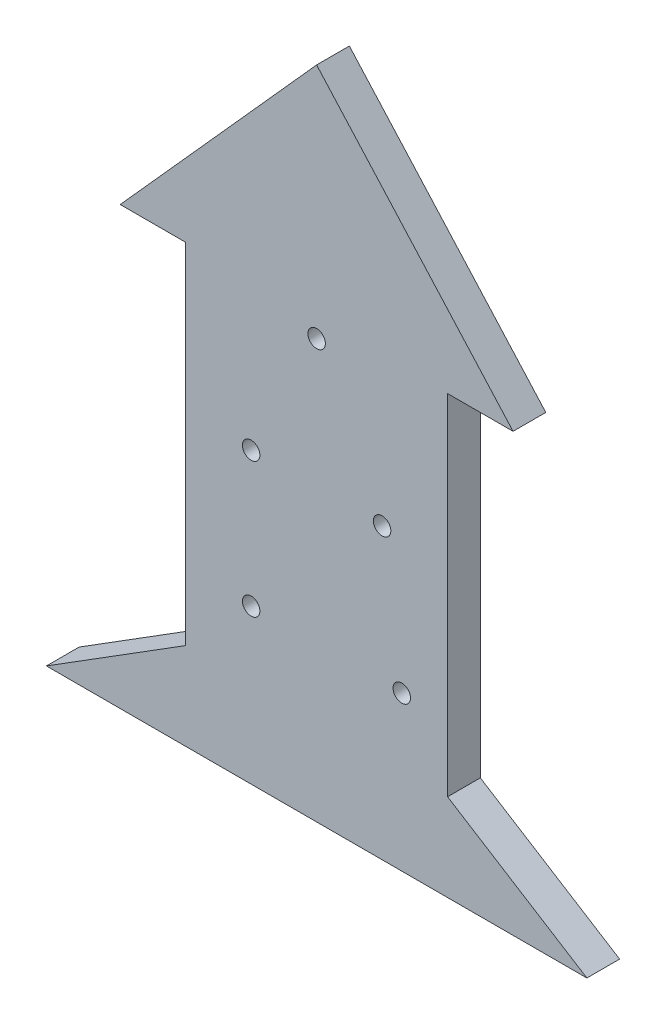
ISO-10303-21;
HEADER;
FILE_DESCRIPTION(('STEP AP214'),'2;1');
FILE_NAME('part.step','',(''),(''),'','','');
FILE_SCHEMA(('AUTOMOTIVE_DESIGN { 1 0 10303 214 1 1 1 1 }'));
ENDSEC;
DATA;
#1=APPLICATION_CONTEXT('core data for automotive mechanical design processes');
#2=APPLICATION_PROTOCOL_DEFINITION('international standard','automotive_design',2000,#1);
#3=PRODUCT_CONTEXT('',#1,'mechanical');
#4=PRODUCT('Part','Part','',(#3));
#5=PRODUCT_RELATED_PRODUCT_CATEGORY('part','',(#4));
#6=PRODUCT_DEFINITION_FORMATION('','',#4);
#7=PRODUCT_DEFINITION_CONTEXT('part definition',#1,'design');
#8=PRODUCT_DEFINITION('design','',#6,#7);
#9=PRODUCT_DEFINITION_SHAPE('','',#8);
#10=(LENGTH_UNIT() NAMED_UNIT(*) SI_UNIT(.MILLI.,.METRE.));
#11=(NAMED_UNIT(*) PLANE_ANGLE_UNIT() SI_UNIT($,.RADIAN.));
#12=(NAMED_UNIT(*) SI_UNIT($,.STERADIAN.) SOLID_ANGLE_UNIT());
#13=UNCERTAINTY_MEASURE_WITH_UNIT(LENGTH_MEASURE(1.E-05),#10,'distance_accuracy_value','');
#14=(GEOMETRIC_REPRESENTATION_CONTEXT(3) GLOBAL_UNCERTAINTY_ASSIGNED_CONTEXT((#13)) GLOBAL_UNIT_ASSIGNED_CONTEXT((#10,
#11,#12)) REPRESENTATION_CONTEXT('',''));
#15=CARTESIAN_POINT('',(0.,0.,0.));
#16=DIRECTION('',(0.,0.,1.));
#17=DIRECTION('',(1.,0.,0.));
#18=AXIS2_PLACEMENT_3D('',#15,#16,#17);
#19=CARTESIAN_POINT('',(-90.,79.2857142857143,15.));
#20=DIRECTION('',(0.,1.,0.));
#21=DIRECTION('',(-1.,0.,0.));
#22=AXIS2_PLACEMENT_3D('',#19,#20,#21);
#23=PLANE('',#22);
#24=DIRECTION('',(1.,0.,0.));
#25=VECTOR('',#24,1.);
#26=CARTESIAN_POINT('',(-90.,79.2857142857143,0.));
#27=LINE('',#26,#25);
#28=CARTESIAN_POINT('',(-90.,79.2857142857143,0.));
#29=VERTEX_POINT('',#28);
#30=CARTESIAN_POINT('',(-60.,79.2857142857144,0.));
#31=VERTEX_POINT('',#30);
#32=EDGE_CURVE('E147',#29,#31,#27,.T.);
#33=ORIENTED_EDGE('',*,*,#32,.T.);
#34=DIRECTION('',(0.,0.,-1.));
#35=VECTOR('',#34,1.);
#36=CARTESIAN_POINT('',(-60.,79.2857142857144,15.));
#37=LINE('',#36,#35);
#38=CARTESIAN_POINT('',(-60.,79.2857142857144,15.));
#39=VERTEX_POINT('',#38);
#40=EDGE_CURVE('E11',#39,#31,#37,.T.);
#41=ORIENTED_EDGE('',*,*,#40,.F.);
#42=DIRECTION('',(1.,0.,0.));
#43=VECTOR('',#42,1.);
#44=CARTESIAN_POINT('',(-90.,79.2857142857143,15.));
#45=LINE('',#44,#43);
#46=CARTESIAN_POINT('',(-90.,79.2857142857143,15.));
#47=VERTEX_POINT('',#46);
#48=EDGE_CURVE('E178',#47,#39,#45,.T.);
#49=ORIENTED_EDGE('',*,*,#48,.F.);
#50=DIRECTION('',(0.,0.,-1.));
#51=VECTOR('',#50,1.);
#52=CARTESIAN_POINT('',(-90.,79.2857142857143,15.));
#53=LINE('',#52,#51);
#54=EDGE_CURVE('E143',#47,#29,#53,.T.);
#55=ORIENTED_EDGE('',*,*,#54,.T.);
#56=EDGE_LOOP('',(#33,#41,#49,#55));
#57=FACE_BOUND('',#56,.T.);
#58=ADVANCED_FACE('F39',(#57),#23,.F.);
#59=CARTESIAN_POINT('',(-60.,79.2857142857144,15.));
#60=DIRECTION('',(1.,0.,0.));
#61=DIRECTION('',(0.,1.,0.));
#62=AXIS2_PLACEMENT_3D('',#59,#60,#61);
#63=PLANE('',#62);
#64=DIRECTION('',(0.,-1.,0.));
#65=VECTOR('',#64,1.);
#66=CARTESIAN_POINT('',(-60.,79.2857142857144,0.));
#67=LINE('',#66,#65);
#68=CARTESIAN_POINT('',(-60.,-80.7142857142856,0.));
#69=VERTEX_POINT('',#68);
#70=EDGE_CURVE('E151',#31,#69,#67,.T.);
#71=ORIENTED_EDGE('',*,*,#70,.T.);
#72=DIRECTION('',(0.,0.,-1.));
#73=VECTOR('',#72,1.);
#74=CARTESIAN_POINT('',(-60.,-80.7142857142856,15.));
#75=LINE('',#74,#73);
#76=CARTESIAN_POINT('',(-60.,-80.7142857142856,15.));
#77=VERTEX_POINT('',#76);
#78=EDGE_CURVE('E49',#77,#69,#75,.T.);
#79=ORIENTED_EDGE('',*,*,#78,.F.);
#80=DIRECTION('',(0.,-1.,0.));
#81=VECTOR('',#80,1.);
#82=CARTESIAN_POINT('',(-60.,79.2857142857144,15.));
#83=LINE('',#82,#81);
#84=EDGE_CURVE('E100',#39,#77,#83,.T.);
#85=ORIENTED_EDGE('',*,*,#84,.F.);
#86=ORIENTED_EDGE('',*,*,#40,.T.);
#87=EDGE_LOOP('',(#71,#79,#85,#86));
#88=FACE_BOUND('',#87,.T.);
#89=ADVANCED_FACE('F266',(#88),#63,.F.);
#90=CARTESIAN_POINT('',(-60.,-80.7142857142856,15.));
#91=DIRECTION('',(0.531072594271218,-0.847326324159729,0.));
#92=DIRECTION('',(0.847326324159729,0.531072594271218,0.));
#93=AXIS2_PLACEMENT_3D('',#90,#91,#92);
#94=PLANE('',#93);
#95=DIRECTION('',(-0.847326324159729,-0.531072594271218,0.));
#96=VECTOR('',#95,1.);
#97=CARTESIAN_POINT('',(-60.,-80.7142857142856,0.));
#98=LINE('',#97,#96);
#99=CARTESIAN_POINT('',(-123.82,-120.714285714286,0.));
#100=VERTEX_POINT('',#99);
#101=EDGE_CURVE('E155',#69,#100,#98,.T.);
#102=ORIENTED_EDGE('',*,*,#101,.T.);
#103=DIRECTION('',(0.,0.,-1.));
#104=VECTOR('',#103,1.);
#105=CARTESIAN_POINT('',(-123.82,-120.714285714286,15.));
#106=LINE('',#105,#104);
#107=CARTESIAN_POINT('',(-123.82,-120.714285714286,15.));
#108=VERTEX_POINT('',#107);
#109=EDGE_CURVE('E191',#108,#100,#106,.T.);
#110=ORIENTED_EDGE('',*,*,#109,.F.);
#111=DIRECTION('',(-0.847326324159729,-0.531072594271218,0.));
#112=VECTOR('',#111,1.);
#113=CARTESIAN_POINT('',(-60.,-80.7142857142856,15.));
#114=LINE('',#113,#112);
#115=EDGE_CURVE('E230',#77,#108,#114,.T.);
#116=ORIENTED_EDGE('',*,*,#115,.F.);
#117=ORIENTED_EDGE('',*,*,#78,.T.);
#118=EDGE_LOOP('',(#102,#110,#116,#117));
#119=FACE_BOUND('',#118,.T.);
#120=ADVANCED_FACE('F271',(#119),#94,.F.);
#121=CARTESIAN_POINT('',(123.820965425105,-120.714285714286,15.));
#122=DIRECTION('',(0.,-1.,0.));
#123=DIRECTION('',(0.,0.,-1.));
#124=AXIS2_PLACEMENT_3D('',#121,#122,#123);
#125=PLANE('',#124);
#126=DIRECTION('',(-1.,0.,0.));
#127=VECTOR('',#126,1.);
#128=CARTESIAN_POINT('',(123.820965425105,-120.714285714286,0.));
#129=LINE('',#128,#127);
#130=CARTESIAN_POINT('',(123.820965425105,-120.714285714286,0.));
#131=VERTEX_POINT('',#130);
#132=EDGE_CURVE('E159',#131,#100,#129,.T.);
#133=ORIENTED_EDGE('',*,*,#132,.F.);
#134=DIRECTION('',(0.,0.,-1.));
#135=VECTOR('',#134,1.);
#136=CARTESIAN_POINT('',(123.820965425105,-120.714285714286,15.));
#137=LINE('',#136,#135);
#138=CARTESIAN_POINT('',(123.820965425105,-120.714285714286,15.));
#139=VERTEX_POINT('',#138);
#140=EDGE_CURVE('E188',#139,#131,#137,.T.);
#141=ORIENTED_EDGE('',*,*,#140,.F.);
#142=DIRECTION('',(-1.,0.,0.));
#143=VECTOR('',#142,1.);
#144=CARTESIAN_POINT('',(123.820965425105,-120.714285714286,15.));
#145=LINE('',#144,#143);
#146=EDGE_CURVE('E233',#139,#108,#145,.T.);
#147=ORIENTED_EDGE('',*,*,#146,.T.);
#148=ORIENTED_EDGE('',*,*,#109,.T.);
#149=EDGE_LOOP('',(#133,#141,#147,#148));
#150=FACE_BOUND('',#149,.T.);
#151=ADVANCED_FACE('F249',(#150),#125,.T.);
#152=CARTESIAN_POINT('',(60.,-80.7142857142856,15.));
#153=DIRECTION('',(0.531066826430131,0.847329939200445,0.));
#154=DIRECTION('',(-0.847329939200445,0.531066826430131,0.));
#155=AXIS2_PLACEMENT_3D('',#152,#153,#154);
#156=PLANE('',#155);
#157=DIRECTION('',(0.847329939200445,-0.531066826430131,0.));
#158=VECTOR('',#157,1.);
#159=CARTESIAN_POINT('',(60.,-80.7142857142856,0.));
#160=LINE('',#159,#158);
#161=CARTESIAN_POINT('',(60.,-80.7142857142856,0.));
#162=VERTEX_POINT('',#161);
#163=EDGE_CURVE('E163',#162,#131,#160,.T.);
#164=ORIENTED_EDGE('',*,*,#163,.F.);
#165=DIRECTION('',(0.,0.,-1.));
#166=VECTOR('',#165,1.);
#167=CARTESIAN_POINT('',(60.,-80.7142857142856,15.));
#168=LINE('',#167,#166);
#169=CARTESIAN_POINT('',(60.,-80.7142857142856,15.));
#170=VERTEX_POINT('',#169);
#171=EDGE_CURVE('E185',#170,#162,#168,.T.);
#172=ORIENTED_EDGE('',*,*,#171,.F.);
#173=DIRECTION('',(0.847329939200445,-0.531066826430131,0.));
#174=VECTOR('',#173,1.);
#175=CARTESIAN_POINT('',(60.,-80.7142857142856,15.));
#176=LINE('',#175,#174);
#177=EDGE_CURVE('E237',#170,#139,#176,.T.);
#178=ORIENTED_EDGE('',*,*,#177,.T.);
#179=ORIENTED_EDGE('',*,*,#140,.T.);
#180=EDGE_LOOP('',(#164,#172,#178,#179));
#181=FACE_BOUND('',#180,.T.);
#182=ADVANCED_FACE('F243',(#181),#156,.T.);
#183=CARTESIAN_POINT('',(60.,-80.7142857142856,15.));
#184=DIRECTION('',(-1.,0.,0.));
#185=DIRECTION('',(0.,0.,1.));
#186=AXIS2_PLACEMENT_3D('',#183,#184,#185);
#187=PLANE('',#186);
#188=DIRECTION('',(0.,1.,0.));
#189=VECTOR('',#188,1.);
#190=CARTESIAN_POINT('',(60.,-80.7142857142856,0.));
#191=LINE('',#190,#189);
#192=CARTESIAN_POINT('',(60.,79.2857142857144,0.));
#193=VERTEX_POINT('',#192);
#194=EDGE_CURVE('E167',#162,#193,#191,.T.);
#195=ORIENTED_EDGE('',*,*,#194,.T.);
#196=DIRECTION('',(0.,0.,-1.));
#197=VECTOR('',#196,1.);
#198=CARTESIAN_POINT('',(60.,79.2857142857144,15.));
#199=LINE('',#198,#197);
#200=CARTESIAN_POINT('',(60.,79.2857142857144,15.));
#201=VERTEX_POINT('',#200);
#202=EDGE_CURVE('E129',#201,#193,#199,.T.);
#203=ORIENTED_EDGE('',*,*,#202,.F.);
#204=DIRECTION('',(0.,1.,0.));
#205=VECTOR('',#204,1.);
#206=CARTESIAN_POINT('',(60.,-80.7142857142856,15.));
#207=LINE('',#206,#205);
#208=EDGE_CURVE('E135',#170,#201,#207,.T.);
#209=ORIENTED_EDGE('',*,*,#208,.F.);
#210=ORIENTED_EDGE('',*,*,#171,.T.);
#211=EDGE_LOOP('',(#195,#203,#209,#210));
#212=FACE_BOUND('',#211,.T.);
#213=ADVANCED_FACE('F256',(#212),#187,.F.);
#214=CARTESIAN_POINT('',(90.,79.2857142857144,15.));
#215=DIRECTION('',(0.,-1.,0.));
#216=DIRECTION('',(0.,0.,-1.));
#217=AXIS2_PLACEMENT_3D('',#214,#215,#216);
#218=PLANE('',#217);
#219=DIRECTION('',(-1.,0.,0.));
#220=VECTOR('',#219,1.);
#221=CARTESIAN_POINT('',(90.,79.2857142857144,0.));
#222=LINE('',#221,#220);
#223=CARTESIAN_POINT('',(90.,79.2857142857144,0.));
#224=VERTEX_POINT('',#223);
#225=EDGE_CURVE('E123',#224,#193,#222,.T.);
#226=ORIENTED_EDGE('',*,*,#225,.F.);
#227=DIRECTION('',(0.,0.,-1.));
#228=VECTOR('',#227,1.);
#229=CARTESIAN_POINT('',(90.,79.2857142857144,15.));
#230=LINE('',#229,#228);
#231=CARTESIAN_POINT('',(90.,79.2857142857144,15.));
#232=VERTEX_POINT('',#231);
#233=EDGE_CURVE('E118',#232,#224,#230,.T.);
#234=ORIENTED_EDGE('',*,*,#233,.F.);
#235=DIRECTION('',(-1.,0.,0.));
#236=VECTOR('',#235,1.);
#237=CARTESIAN_POINT('',(90.,79.2857142857144,15.));
#238=LINE('',#237,#236);
#239=EDGE_CURVE('E121',#232,#201,#238,.T.);
#240=ORIENTED_EDGE('',*,*,#239,.T.);
#241=ORIENTED_EDGE('',*,*,#202,.T.);
#242=EDGE_LOOP('',(#226,#234,#240,#241));
#243=FACE_BOUND('',#242,.T.);
#244=ADVANCED_FACE('F120',(#243),#218,.T.);
#245=CARTESIAN_POINT('',(-6.84174938925253E-12,179.686053035495,15.));
#246=DIRECTION('',(0.744621402914459,0.66748705329894,0.));
#247=DIRECTION('',(-0.66748705329894,0.744621402914459,0.));
#248=AXIS2_PLACEMENT_3D('',#245,#246,#247);
#249=PLANE('',#248);
#250=DIRECTION('',(0.66748705329894,-0.744621402914459,0.));
#251=VECTOR('',#250,1.);
#252=CARTESIAN_POINT('',(-6.84174938925253E-12,179.686053035495,0.));
#253=LINE('',#252,#251);
#254=CARTESIAN_POINT('',(-6.84174938925253E-12,179.686053035495,0.));
#255=VERTEX_POINT('',#254);
#256=EDGE_CURVE('E173',#255,#224,#253,.T.);
#257=ORIENTED_EDGE('',*,*,#256,.F.);
#258=DIRECTION('',(0.,0.,-1.));
#259=VECTOR('',#258,1.);
#260=CARTESIAN_POINT('',(-6.84174938925253E-12,179.686053035495,15.));
#261=LINE('',#260,#259);
#262=CARTESIAN_POINT('',(-6.84174938925253E-12,179.686053035495,15.));
#263=VERTEX_POINT('',#262);
#264=EDGE_CURVE('E89',#263,#255,#261,.T.);
#265=ORIENTED_EDGE('',*,*,#264,.F.);
#266=DIRECTION('',(0.66748705329894,-0.744621402914459,0.));
#267=VECTOR('',#266,1.);
#268=CARTESIAN_POINT('',(-6.84174938925253E-12,179.686053035495,15.));
#269=LINE('',#268,#267);
#270=EDGE_CURVE('E132',#263,#232,#269,.T.);
#271=ORIENTED_EDGE('',*,*,#270,.T.);
#272=ORIENTED_EDGE('',*,*,#233,.T.);
#273=EDGE_LOOP('',(#257,#265,#271,#272));
#274=FACE_BOUND('',#273,.T.);
#275=ADVANCED_FACE('F139',(#274),#249,.T.);
#276=CARTESIAN_POINT('',(-6.84174938925253E-12,179.686053035495,15.));
#277=DIRECTION('',(0.74462140291451,-0.667487053298884,0.));
#278=DIRECTION('',(0.667487053298884,0.74462140291451,0.));
#279=AXIS2_PLACEMENT_3D('',#276,#277,#278);
#280=PLANE('',#279);
#281=DIRECTION('',(-0.667487053298884,-0.74462140291451,0.));
#282=VECTOR('',#281,1.);
#283=CARTESIAN_POINT('',(-6.84174938925253E-12,179.686053035495,0.));
#284=LINE('',#283,#282);
#285=EDGE_CURVE('E92',#255,#29,#284,.T.);
#286=ORIENTED_EDGE('',*,*,#285,.T.);
#287=ORIENTED_EDGE('',*,*,#54,.F.);
#288=DIRECTION('',(-0.667487053298884,-0.74462140291451,0.));
#289=VECTOR('',#288,1.);
#290=CARTESIAN_POINT('',(-6.84174938925253E-12,179.686053035495,15.));
#291=LINE('',#290,#289);
#292=EDGE_CURVE('E58',#263,#47,#291,.T.);
#293=ORIENTED_EDGE('',*,*,#292,.F.);
#294=ORIENTED_EDGE('',*,*,#264,.T.);
#295=EDGE_LOOP('',(#286,#287,#293,#294));
#296=FACE_BOUND('',#295,.T.);
#297=ADVANCED_FACE('F306',(#296),#280,.F.);
#298=CARTESIAN_POINT('',(0.,0.,15.));
#299=DIRECTION('',(0.,0.,-1.));
#300=DIRECTION('',(-1.,0.,0.));
#301=AXIS2_PLACEMENT_3D('',#298,#299,#300);
#302=PLANE('',#301);
#303=CARTESIAN_POINT('',(39.0138403525375,-50.0536972186551,15.));
#304=DIRECTION('',(0.,0.,1.));
#305=DIRECTION('',(1.,0.,0.));
#306=AXIS2_PLACEMENT_3D('',#303,#304,#305);
#307=CIRCLE('',#306,4.00000000000001);
#308=CARTESIAN_POINT('',(43.0138403525375,-50.0536972186551,15.));
#309=VERTEX_POINT('',#308);
#310=EDGE_CURVE('E387',#309,#309,#307,.T.);
#311=ORIENTED_EDGE('',*,*,#310,.F.);
#312=EDGE_LOOP('',(#311));
#313=FACE_BOUND('',#312,.T.);
#314=CARTESIAN_POINT('',(-30.,11.7869125723797,15.));
#315=DIRECTION('',(0.,0.,1.));
#316=DIRECTION('',(1.,0.,0.));
#317=AXIS2_PLACEMENT_3D('',#314,#315,#316);
#318=CIRCLE('',#317,4.);
#319=CARTESIAN_POINT('',(-26.,11.7869125723797,15.));
#320=VERTEX_POINT('',#319);
#321=EDGE_CURVE('E389',#320,#320,#318,.T.);
#322=ORIENTED_EDGE('',*,*,#321,.F.);
#323=EDGE_LOOP('',(#322));
#324=FACE_BOUND('',#323,.T.);
#325=CARTESIAN_POINT('',(-30.,-50.0536972186551,15.));
#326=DIRECTION('',(0.,0.,1.));
#327=DIRECTION('',(1.,0.,0.));
#328=AXIS2_PLACEMENT_3D('',#325,#326,#327);
#329=CIRCLE('',#328,4.);
#330=CARTESIAN_POINT('',(-26.,-50.0536972186551,15.));
#331=VERTEX_POINT('',#330);
#332=EDGE_CURVE('E395',#331,#331,#329,.T.);
#333=ORIENTED_EDGE('',*,*,#332,.F.);
#334=EDGE_LOOP('',(#333));
#335=FACE_BOUND('',#334,.T.);
#336=CARTESIAN_POINT('',(30.,11.7869125723797,15.));
#337=DIRECTION('',(0.,0.,1.));
#338=DIRECTION('',(1.,0.,0.));
#339=AXIS2_PLACEMENT_3D('',#336,#337,#338);
#340=CIRCLE('',#339,4.00000000000001);
#341=CARTESIAN_POINT('',(34.,11.7869125723797,15.));
#342=VERTEX_POINT('',#341);
#343=EDGE_CURVE('E206',#342,#342,#340,.T.);
#344=ORIENTED_EDGE('',*,*,#343,.F.);
#345=EDGE_LOOP('',(#344));
#346=FACE_BOUND('',#345,.T.);
#347=CARTESIAN_POINT('',(0.,71.0925675524939,15.));
#348=DIRECTION('',(0.,0.,1.));
#349=DIRECTION('',(1.,0.,0.));
#350=AXIS2_PLACEMENT_3D('',#347,#348,#349);
#351=CIRCLE('',#350,4.);
#352=CARTESIAN_POINT('',(4.,71.0925675524939,15.));
#353=VERTEX_POINT('',#352);
#354=EDGE_CURVE('E200',#353,#353,#351,.T.);
#355=ORIENTED_EDGE('',*,*,#354,.F.);
#356=EDGE_LOOP('',(#355));
#357=FACE_BOUND('',#356,.T.);
#358=ORIENTED_EDGE('',*,*,#48,.T.);
#359=ORIENTED_EDGE('',*,*,#84,.T.);
#360=ORIENTED_EDGE('',*,*,#115,.T.);
#361=ORIENTED_EDGE('',*,*,#146,.F.);
#362=ORIENTED_EDGE('',*,*,#177,.F.);
#363=ORIENTED_EDGE('',*,*,#208,.T.);
#364=ORIENTED_EDGE('',*,*,#239,.F.);
#365=ORIENTED_EDGE('',*,*,#270,.F.);
#366=ORIENTED_EDGE('',*,*,#292,.T.);
#367=EDGE_LOOP('',(#358,#359,#360,#361,#362,#363,#364,#365,#366));
#368=FACE_BOUND('',#367,.T.);
#369=ADVANCED_FACE('F131',(#313,#324,#335,#346,#357,#368),#302,.F.);
#370=CARTESIAN_POINT('',(0.,0.,0.));
#371=DIRECTION('',(0.,0.,-1.));
#372=DIRECTION('',(-1.,0.,0.));
#373=AXIS2_PLACEMENT_3D('',#370,#371,#372);
#374=PLANE('',#373);
#375=CARTESIAN_POINT('',(39.0138403525375,-50.0536972186551,0.));
#376=DIRECTION('',(0.,0.,-1.));
#377=DIRECTION('',(-1.,0.,0.));
#378=AXIS2_PLACEMENT_3D('',#375,#376,#377);
#379=CIRCLE('',#378,4.00000000000001);
#380=CARTESIAN_POINT('',(35.0138403525375,-50.0536972186551,0.));
#381=VERTEX_POINT('',#380);
#382=EDGE_CURVE('E42',#381,#381,#379,.T.);
#383=ORIENTED_EDGE('',*,*,#382,.F.);
#384=EDGE_LOOP('',(#383));
#385=FACE_BOUND('',#384,.T.);
#386=CARTESIAN_POINT('',(-30.,11.7869125723797,0.));
#387=DIRECTION('',(0.,0.,-1.));
#388=DIRECTION('',(-1.,0.,0.));
#389=AXIS2_PLACEMENT_3D('',#386,#387,#388);
#390=CIRCLE('',#389,4.);
#391=CARTESIAN_POINT('',(-34.,11.7869125723797,0.));
#392=VERTEX_POINT('',#391);
#393=EDGE_CURVE('E209',#392,#392,#390,.T.);
#394=ORIENTED_EDGE('',*,*,#393,.F.);
#395=EDGE_LOOP('',(#394));
#396=FACE_BOUND('',#395,.T.);
#397=CARTESIAN_POINT('',(-30.,-50.0536972186551,0.));
#398=DIRECTION('',(0.,0.,-1.));
#399=DIRECTION('',(-1.,0.,0.));
#400=AXIS2_PLACEMENT_3D('',#397,#398,#399);
#401=CIRCLE('',#400,4.);
#402=CARTESIAN_POINT('',(-34.,-50.0536972186551,0.));
#403=VERTEX_POINT('',#402);
#404=EDGE_CURVE('E205',#403,#403,#401,.T.);
#405=ORIENTED_EDGE('',*,*,#404,.F.);
#406=EDGE_LOOP('',(#405));
#407=FACE_BOUND('',#406,.T.);
#408=CARTESIAN_POINT('',(30.,11.7869125723797,0.));
#409=DIRECTION('',(0.,0.,-1.));
#410=DIRECTION('',(-1.,0.,0.));
#411=AXIS2_PLACEMENT_3D('',#408,#409,#410);
#412=CIRCLE('',#411,4.00000000000001);
#413=CARTESIAN_POINT('',(26.,11.7869125723797,0.));
#414=VERTEX_POINT('',#413);
#415=EDGE_CURVE('E201',#414,#414,#412,.T.);
#416=ORIENTED_EDGE('',*,*,#415,.F.);
#417=EDGE_LOOP('',(#416));
#418=FACE_BOUND('',#417,.T.);
#419=CARTESIAN_POINT('',(0.,71.0925675524939,0.));
#420=DIRECTION('',(0.,0.,-1.));
#421=DIRECTION('',(-1.,0.,0.));
#422=AXIS2_PLACEMENT_3D('',#419,#420,#421);
#423=CIRCLE('',#422,4.);
#424=CARTESIAN_POINT('',(-4.,71.0925675524939,0.));
#425=VERTEX_POINT('',#424);
#426=EDGE_CURVE('E152',#425,#425,#423,.T.);
#427=ORIENTED_EDGE('',*,*,#426,.F.);
#428=EDGE_LOOP('',(#427));
#429=FACE_BOUND('',#428,.T.);
#430=ORIENTED_EDGE('',*,*,#32,.F.);
#431=ORIENTED_EDGE('',*,*,#285,.F.);
#432=ORIENTED_EDGE('',*,*,#256,.T.);
#433=ORIENTED_EDGE('',*,*,#225,.T.);
#434=ORIENTED_EDGE('',*,*,#194,.F.);
#435=ORIENTED_EDGE('',*,*,#163,.T.);
#436=ORIENTED_EDGE('',*,*,#132,.T.);
#437=ORIENTED_EDGE('',*,*,#101,.F.);
#438=ORIENTED_EDGE('',*,*,#70,.F.);
#439=EDGE_LOOP('',(#430,#431,#432,#433,#434,#435,#436,#437,#438));
#440=FACE_BOUND('',#439,.T.);
#441=ADVANCED_FACE('F254',(#385,#396,#407,#418,#429,#440),#374,.T.);
#442=CARTESIAN_POINT('',(0.,71.0925675524939,-45.));
#443=DIRECTION('',(0.,0.,1.));
#444=DIRECTION('',(1.,0.,0.));
#445=AXIS2_PLACEMENT_3D('',#442,#443,#444);
#446=CYLINDRICAL_SURFACE('',#445,4.);
#447=ORIENTED_EDGE('',*,*,#426,.T.);
#448=EDGE_LOOP('',(#447));
#449=FACE_BOUND('',#448,.T.);
#450=ORIENTED_EDGE('',*,*,#354,.T.);
#451=EDGE_LOOP('',(#450));
#452=FACE_BOUND('',#451,.T.);
#453=ADVANCED_FACE('F321',(#449,#452),#446,.F.);
#454=CARTESIAN_POINT('',(30.,11.7869125723797,-45.));
#455=DIRECTION('',(0.,0.,1.));
#456=DIRECTION('',(1.,0.,0.));
#457=AXIS2_PLACEMENT_3D('',#454,#455,#456);
#458=CYLINDRICAL_SURFACE('',#457,4.00000000000001);
#459=ORIENTED_EDGE('',*,*,#415,.T.);
#460=EDGE_LOOP('',(#459));
#461=FACE_BOUND('',#460,.T.);
#462=ORIENTED_EDGE('',*,*,#343,.T.);
#463=EDGE_LOOP('',(#462));
#464=FACE_BOUND('',#463,.T.);
#465=ADVANCED_FACE('F326',(#461,#464),#458,.F.);
#466=CARTESIAN_POINT('',(-30.,-50.0536972186551,-45.));
#467=DIRECTION('',(0.,0.,1.));
#468=DIRECTION('',(1.,0.,0.));
#469=AXIS2_PLACEMENT_3D('',#466,#467,#468);
#470=CYLINDRICAL_SURFACE('',#469,4.);
#471=ORIENTED_EDGE('',*,*,#404,.T.);
#472=EDGE_LOOP('',(#471));
#473=FACE_BOUND('',#472,.T.);
#474=ORIENTED_EDGE('',*,*,#332,.T.);
#475=EDGE_LOOP('',(#474));
#476=FACE_BOUND('',#475,.T.);
#477=ADVANCED_FACE('F352',(#473,#476),#470,.F.);
#478=CARTESIAN_POINT('',(-30.,11.7869125723797,-45.));
#479=DIRECTION('',(0.,0.,1.));
#480=DIRECTION('',(1.,0.,0.));
#481=AXIS2_PLACEMENT_3D('',#478,#479,#480);
#482=CYLINDRICAL_SURFACE('',#481,4.);
#483=ORIENTED_EDGE('',*,*,#393,.T.);
#484=EDGE_LOOP('',(#483));
#485=FACE_BOUND('',#484,.T.);
#486=ORIENTED_EDGE('',*,*,#321,.T.);
#487=EDGE_LOOP('',(#486));
#488=FACE_BOUND('',#487,.T.);
#489=ADVANCED_FACE('F362',(#485,#488),#482,.F.);
#490=CARTESIAN_POINT('',(39.0138403525375,-50.0536972186551,-45.));
#491=DIRECTION('',(0.,0.,1.));
#492=DIRECTION('',(1.,0.,0.));
#493=AXIS2_PLACEMENT_3D('',#490,#491,#492);
#494=CYLINDRICAL_SURFACE('',#493,4.00000000000001);
#495=ORIENTED_EDGE('',*,*,#382,.T.);
#496=EDGE_LOOP('',(#495));
#497=FACE_BOUND('',#496,.T.);
#498=ORIENTED_EDGE('',*,*,#310,.T.);
#499=EDGE_LOOP('',(#498));
#500=FACE_BOUND('',#499,.T.);
#501=ADVANCED_FACE('F372',(#497,#500),#494,.F.);
#502=CLOSED_SHELL('',(#58,#89,#120,#151,#182,#213,#244,#275,#297,#369,#441,#453,#465,#477,#489,#501));
#503=MANIFOLD_SOLID_BREP('B2',#502);
#504=ADVANCED_BREP_SHAPE_REPRESENTATION('',(#18,#503),#14);
#505=SHAPE_DEFINITION_REPRESENTATION(#9,#504);
ENDSEC;
END-ISO-10303-21;
